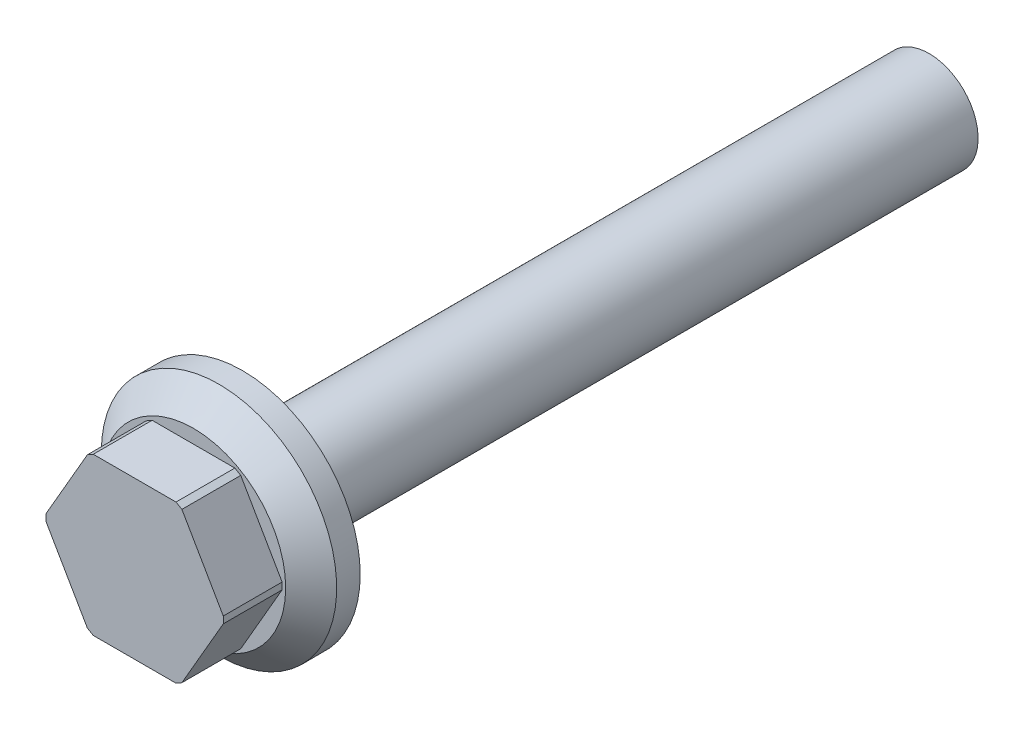
ISO-10303-21;
HEADER;
FILE_DESCRIPTION(('STEP AP214'),'2;1');
FILE_NAME('part.step','',(''),(''),'','','');
FILE_SCHEMA(('AUTOMOTIVE_DESIGN { 1 0 10303 214 1 1 1 1 }'));
ENDSEC;
DATA;
#1=APPLICATION_CONTEXT('core data for automotive mechanical design processes');
#2=APPLICATION_PROTOCOL_DEFINITION('international standard','automotive_design',2000,#1);
#3=PRODUCT_CONTEXT('',#1,'mechanical');
#4=PRODUCT('Part','Part','',(#3));
#5=PRODUCT_RELATED_PRODUCT_CATEGORY('part','',(#4));
#6=PRODUCT_DEFINITION_FORMATION('','',#4);
#7=PRODUCT_DEFINITION_CONTEXT('part definition',#1,'design');
#8=PRODUCT_DEFINITION('design','',#6,#7);
#9=PRODUCT_DEFINITION_SHAPE('','',#8);
#10=(LENGTH_UNIT() NAMED_UNIT(*) SI_UNIT(.MILLI.,.METRE.));
#11=(NAMED_UNIT(*) PLANE_ANGLE_UNIT() SI_UNIT($,.RADIAN.));
#12=(NAMED_UNIT(*) SI_UNIT($,.STERADIAN.) SOLID_ANGLE_UNIT());
#13=UNCERTAINTY_MEASURE_WITH_UNIT(LENGTH_MEASURE(1.E-05),#10,'distance_accuracy_value','');
#14=(GEOMETRIC_REPRESENTATION_CONTEXT(3) GLOBAL_UNCERTAINTY_ASSIGNED_CONTEXT((#13)) GLOBAL_UNIT_ASSIGNED_CONTEXT((#10,
#11,#12)) REPRESENTATION_CONTEXT('',''));
#15=CARTESIAN_POINT('',(0.,0.,0.));
#16=DIRECTION('',(0.,0.,1.));
#17=DIRECTION('',(1.,0.,0.));
#18=AXIS2_PLACEMENT_3D('',#15,#16,#17);
#19=CARTESIAN_POINT('',(0.,0.,-35.));
#20=DIRECTION('',(0.,0.,-1.));
#21=DIRECTION('',(-1.,0.,0.));
#22=AXIS2_PLACEMENT_3D('',#19,#20,#21);
#23=CYLINDRICAL_SURFACE('',#22,2.5);
#24=CARTESIAN_POINT('',(0.,0.,-35.));
#25=DIRECTION('',(0.,0.,-1.));
#26=DIRECTION('',(-1.,0.,0.));
#27=AXIS2_PLACEMENT_3D('',#24,#25,#26);
#28=CIRCLE('',#27,2.5);
#29=CARTESIAN_POINT('',(-2.5,0.,-35.));
#30=VERTEX_POINT('',#29);
#31=EDGE_CURVE('E229',#30,#30,#28,.T.);
#32=ORIENTED_EDGE('',*,*,#31,.F.);
#33=EDGE_LOOP('',(#32));
#34=FACE_BOUND('',#33,.T.);
#35=CARTESIAN_POINT('',(0.,0.,0.));
#36=DIRECTION('',(0.,0.,-1.));
#37=DIRECTION('',(-1.,0.,0.));
#38=AXIS2_PLACEMENT_3D('',#35,#36,#37);
#39=CIRCLE('',#38,2.5);
#40=CARTESIAN_POINT('',(-2.5,0.,0.));
#41=VERTEX_POINT('',#40);
#42=EDGE_CURVE('E228',#41,#41,#39,.T.);
#43=ORIENTED_EDGE('',*,*,#42,.T.);
#44=EDGE_LOOP('',(#43));
#45=FACE_BOUND('',#44,.T.);
#46=ADVANCED_FACE('F35',(#34,#45),#23,.T.);
#47=CARTESIAN_POINT('',(2.5,0.,-35.));
#48=DIRECTION('',(0.,0.,1.));
#49=DIRECTION('',(1.,0.,0.));
#50=AXIS2_PLACEMENT_3D('',#47,#48,#49);
#51=PLANE('',#50);
#52=ORIENTED_EDGE('',*,*,#31,.T.);
#53=EDGE_LOOP('',(#52));
#54=FACE_BOUND('',#53,.T.);
#55=ADVANCED_FACE('F276',(#54),#51,.F.);
#56=CARTESIAN_POINT('',(0.,0.,1.));
#57=DIRECTION('',(0.,0.,-1.));
#58=DIRECTION('',(-1.,0.,0.));
#59=AXIS2_PLACEMENT_3D('',#56,#57,#58);
#60=CYLINDRICAL_SURFACE('',#59,6.);
#61=CARTESIAN_POINT('',(0.,0.,1.20000000000002));
#62=DIRECTION('',(0.,0.,-1.));
#63=DIRECTION('',(-1.,0.,0.));
#64=AXIS2_PLACEMENT_3D('',#61,#62,#63);
#65=CIRCLE('',#64,6.);
#66=CARTESIAN_POINT('',(-6.,0.,1.20000000000002));
#67=VERTEX_POINT('',#66);
#68=EDGE_CURVE('E237',#67,#67,#65,.T.);
#69=ORIENTED_EDGE('',*,*,#68,.T.);
#70=EDGE_LOOP('',(#69));
#71=FACE_BOUND('',#70,.T.);
#72=CARTESIAN_POINT('',(0.,0.,0.));
#73=DIRECTION('',(0.,0.,1.));
#74=DIRECTION('',(1.,0.,0.));
#75=AXIS2_PLACEMENT_3D('',#72,#73,#74);
#76=CIRCLE('',#75,6.);
#77=CARTESIAN_POINT('',(6.,0.,0.));
#78=VERTEX_POINT('',#77);
#79=EDGE_CURVE('E225',#78,#78,#76,.T.);
#80=ORIENTED_EDGE('',*,*,#79,.T.);
#81=EDGE_LOOP('',(#80));
#82=FACE_BOUND('',#81,.T.);
#83=ADVANCED_FACE('F282',(#71,#82),#60,.T.);
#84=CARTESIAN_POINT('',(0.,0.,0.));
#85=DIRECTION('',(0.,0.,1.));
#86=DIRECTION('',(1.,0.,0.));
#87=AXIS2_PLACEMENT_3D('',#84,#85,#86);
#88=PLANE('',#87);
#89=ORIENTED_EDGE('',*,*,#42,.F.);
#90=EDGE_LOOP('',(#89));
#91=FACE_BOUND('',#90,.T.);
#92=ORIENTED_EDGE('',*,*,#79,.F.);
#93=EDGE_LOOP('',(#92));
#94=FACE_BOUND('',#93,.T.);
#95=ADVANCED_FACE('F336',(#91,#94),#88,.F.);
#96=CARTESIAN_POINT('',(0.,0.,2.5));
#97=DIRECTION('',(0.,0.,1.));
#98=DIRECTION('',(1.,0.,0.));
#99=AXIS2_PLACEMENT_3D('',#96,#97,#98);
#100=PLANE('',#99);
#101=DIRECTION('',(-1.,0.,0.));
#102=VECTOR('',#101,1.);
#103=CARTESIAN_POINT('',(0.,4.,2.5));
#104=LINE('',#103,#102);
#105=CARTESIAN_POINT('',(2.1094010767585,4.,2.5));
#106=VERTEX_POINT('',#105);
#107=CARTESIAN_POINT('',(-2.10940107675849,4.,2.5));
#108=VERTEX_POINT('',#107);
#109=EDGE_CURVE('E135',#106,#108,#104,.T.);
#110=ORIENTED_EDGE('',*,*,#109,.F.);
#111=DIRECTION('',(-0.866025403784437,0.500000000000002,0.));
#112=VECTOR('',#111,1.);
#113=CARTESIAN_POINT('',(2.40940107675851,3.8267949192431,2.5));
#114=LINE('',#113,#112);
#115=CARTESIAN_POINT('',(2.40940107675851,3.8267949192431,2.5));
#116=VERTEX_POINT('',#115);
#117=EDGE_CURVE('E161',#106,#116,#114,.F.);
#118=ORIENTED_EDGE('',*,*,#117,.T.);
#119=DIRECTION('',(-0.5,0.866025403784439,0.));
#120=VECTOR('',#119,1.);
#121=CARTESIAN_POINT('',(3.46410161513776,2.,2.5));
#122=LINE('',#121,#120);
#123=CARTESIAN_POINT('',(4.51880215351701,0.173205080756891,2.5));
#124=VERTEX_POINT('',#123);
#125=EDGE_CURVE('E171',#124,#116,#122,.T.);
#126=ORIENTED_EDGE('',*,*,#125,.F.);
#127=DIRECTION('',(0.,1.,0.));
#128=VECTOR('',#127,1.);
#129=CARTESIAN_POINT('',(4.51880215351701,-0.173205080756894,2.5));
#130=LINE('',#129,#128);
#131=CARTESIAN_POINT('',(4.51880215351701,-0.173205080756895,2.5));
#132=VERTEX_POINT('',#131);
#133=EDGE_CURVE('E44',#124,#132,#130,.F.);
#134=ORIENTED_EDGE('',*,*,#133,.T.);
#135=DIRECTION('',(0.5,0.866025403784439,0.));
#136=VECTOR('',#135,1.);
#137=CARTESIAN_POINT('',(3.46410161513776,-2.,2.5));
#138=LINE('',#137,#136);
#139=CARTESIAN_POINT('',(2.40940107675851,-3.8267949192431,2.5));
#140=VERTEX_POINT('',#139);
#141=EDGE_CURVE('E168',#140,#132,#138,.T.);
#142=ORIENTED_EDGE('',*,*,#141,.F.);
#143=DIRECTION('',(0.86602540378444,0.499999999999998,0.));
#144=VECTOR('',#143,1.);
#145=CARTESIAN_POINT('',(2.10940107675849,-4.,2.5));
#146=LINE('',#145,#144);
#147=CARTESIAN_POINT('',(2.10940107675849,-4.,2.5));
#148=VERTEX_POINT('',#147);
#149=EDGE_CURVE('E159',#140,#148,#146,.F.);
#150=ORIENTED_EDGE('',*,*,#149,.T.);
#151=DIRECTION('',(1.,0.,0.));
#152=VECTOR('',#151,1.);
#153=CARTESIAN_POINT('',(0.,-4.,2.5));
#154=LINE('',#153,#152);
#155=CARTESIAN_POINT('',(-2.10940107675851,-4.,2.5));
#156=VERTEX_POINT('',#155);
#157=EDGE_CURVE('E143',#156,#148,#154,.T.);
#158=ORIENTED_EDGE('',*,*,#157,.F.);
#159=DIRECTION('',(0.866025403784436,-0.500000000000004,0.));
#160=VECTOR('',#159,1.);
#161=CARTESIAN_POINT('',(-2.4094010767585,-3.82679491924312,2.5));
#162=LINE('',#161,#160);
#163=CARTESIAN_POINT('',(-2.4094010767585,-3.82679491924312,2.5));
#164=VERTEX_POINT('',#163);
#165=EDGE_CURVE('E142',#156,#164,#162,.F.);
#166=ORIENTED_EDGE('',*,*,#165,.T.);
#167=DIRECTION('',(0.5,-0.866025403784439,0.));
#168=VECTOR('',#167,1.);
#169=CARTESIAN_POINT('',(-3.46410161513776,-2.,2.5));
#170=LINE('',#169,#168);
#171=CARTESIAN_POINT('',(-4.51880215351701,-0.173205080756888,2.5));
#172=VERTEX_POINT('',#171);
#173=EDGE_CURVE('E129',#172,#164,#170,.T.);
#174=ORIENTED_EDGE('',*,*,#173,.F.);
#175=DIRECTION('',(0.,-1.,0.));
#176=VECTOR('',#175,1.);
#177=CARTESIAN_POINT('',(-4.51880215351701,0.173205080756892,2.5));
#178=LINE('',#177,#176);
#179=CARTESIAN_POINT('',(-4.51880215351701,0.173205080756892,2.5));
#180=VERTEX_POINT('',#179);
#181=EDGE_CURVE('E11',#172,#180,#178,.F.);
#182=ORIENTED_EDGE('',*,*,#181,.T.);
#183=DIRECTION('',(-0.5,-0.866025403784439,0.));
#184=VECTOR('',#183,1.);
#185=CARTESIAN_POINT('',(-3.46410161513776,2.,2.5));
#186=LINE('',#185,#184);
#187=CARTESIAN_POINT('',(-2.40940107675851,3.82679491924311,2.5));
#188=VERTEX_POINT('',#187);
#189=EDGE_CURVE('E144',#188,#180,#186,.T.);
#190=ORIENTED_EDGE('',*,*,#189,.F.);
#191=DIRECTION('',(-0.866025403784438,-0.500000000000001,0.));
#192=VECTOR('',#191,1.);
#193=CARTESIAN_POINT('',(-2.10940107675849,4.,2.5));
#194=LINE('',#193,#192);
#195=EDGE_CURVE('E163',#188,#108,#194,.F.);
#196=ORIENTED_EDGE('',*,*,#195,.T.);
#197=EDGE_LOOP('',(#110,#118,#126,#134,#142,#150,#158,#166,#174,#182,#190,#196));
#198=FACE_BOUND('',#197,.T.);
#199=CARTESIAN_POINT('',(0.,0.,2.5));
#200=DIRECTION('',(0.,0.,1.));
#201=DIRECTION('',(1.,0.,0.));
#202=AXIS2_PLACEMENT_3D('',#199,#200,#201);
#203=CIRCLE('',#202,4.70000000000003);
#204=CARTESIAN_POINT('',(-4.70000000000003,0.,2.5));
#205=VERTEX_POINT('',#204);
#206=EDGE_CURVE('E232',#205,#205,#203,.T.);
#207=ORIENTED_EDGE('',*,*,#206,.T.);
#208=EDGE_LOOP('',(#207));
#209=FACE_BOUND('',#208,.T.);
#210=ADVANCED_FACE('F138',(#198,#209),#100,.T.);
#211=CARTESIAN_POINT('',(0.,0.,2.80000000000003));
#212=DIRECTION('',(0.,0.,-1.));
#213=DIRECTION('',(-1.,0.,0.));
#214=AXIS2_PLACEMENT_3D('',#211,#212,#213);
#215=CONICAL_SURFACE('',#214,4.4,0.785398163397443);
#216=CARTESIAN_POINT('',(-6.,0.,1.20000000000002));
#217=CARTESIAN_POINT('',(-5.98645833333333,0.,1.21354166666668));
#218=CARTESIAN_POINT('',(-5.97291666666667,0.,1.22708333333335));
#219=CARTESIAN_POINT('',(-5.94583333333333,0.,1.25416666666668));
#220=CARTESIAN_POINT('',(-5.93229166666667,0.,1.26770833333335));
#221=CARTESIAN_POINT('',(-5.90520833333333,0.,1.29479166666668));
#222=CARTESIAN_POINT('',(-5.89166666666667,0.,1.30833333333335));
#223=CARTESIAN_POINT('',(-5.86458333333334,0.,1.33541666666668));
#224=CARTESIAN_POINT('',(-5.85104166666667,0.,1.34895833333335));
#225=CARTESIAN_POINT('',(-5.82395833333334,0.,1.37604166666668));
#226=CARTESIAN_POINT('',(-5.81041666666667,0.,1.38958333333335));
#227=CARTESIAN_POINT('',(-5.78333333333334,0.,1.41666666666668));
#228=CARTESIAN_POINT('',(-5.76979166666667,0.,1.43020833333335));
#229=CARTESIAN_POINT('',(-5.74270833333334,0.,1.45729166666668));
#230=CARTESIAN_POINT('',(-5.72916666666667,0.,1.47083333333335));
#231=CARTESIAN_POINT('',(-5.70208333333334,0.,1.49791666666668));
#232=CARTESIAN_POINT('',(-5.68854166666667,0.,1.51145833333335));
#233=CARTESIAN_POINT('',(-5.66145833333334,0.,1.53854166666668));
#234=CARTESIAN_POINT('',(-5.64791666666667,0.,1.55208333333335));
#235=CARTESIAN_POINT('',(-5.62083333333334,0.,1.57916666666668));
#236=CARTESIAN_POINT('',(-5.60729166666667,0.,1.59270833333334));
#237=CARTESIAN_POINT('',(-5.58020833333334,0.,1.61979166666668));
#238=CARTESIAN_POINT('',(-5.56666666666668,0.,1.63333333333334));
#239=CARTESIAN_POINT('',(-5.53958333333334,0.,1.66041666666668));
#240=CARTESIAN_POINT('',(-5.52604166666668,0.,1.67395833333334));
#241=CARTESIAN_POINT('',(-5.49895833333334,0.,1.70104166666668));
#242=CARTESIAN_POINT('',(-5.48541666666668,0.,1.71458333333334));
#243=CARTESIAN_POINT('',(-5.45833333333335,0.,1.74166666666668));
#244=CARTESIAN_POINT('',(-5.44479166666668,0.,1.75520833333334));
#245=CARTESIAN_POINT('',(-5.41770833333335,0.,1.78229166666668));
#246=CARTESIAN_POINT('',(-5.40416666666668,0.,1.79583333333334));
#247=CARTESIAN_POINT('',(-5.37708333333335,0.,1.82291666666668));
#248=CARTESIAN_POINT('',(-5.36354166666668,0.,1.83645833333334));
#249=CARTESIAN_POINT('',(-5.33645833333335,0.,1.86354166666667));
#250=CARTESIAN_POINT('',(-5.32291666666668,0.,1.87708333333334));
#251=CARTESIAN_POINT('',(-5.29583333333335,0.,1.90416666666667));
#252=CARTESIAN_POINT('',(-5.28229166666668,0.,1.91770833333334));
#253=CARTESIAN_POINT('',(-5.25520833333335,0.,1.94479166666667));
#254=CARTESIAN_POINT('',(-5.24166666666668,0.,1.95833333333334));
#255=CARTESIAN_POINT('',(-5.21458333333335,0.,1.98541666666667));
#256=CARTESIAN_POINT('',(-5.20104166666668,0.,1.99895833333334));
#257=CARTESIAN_POINT('',(-5.17395833333335,0.,2.02604166666667));
#258=CARTESIAN_POINT('',(-5.16041666666669,0.,2.03958333333334));
#259=CARTESIAN_POINT('',(-5.13333333333335,0.,2.06666666666667));
#260=CARTESIAN_POINT('',(-5.11979166666669,0.,2.08020833333334));
#261=CARTESIAN_POINT('',(-5.09270833333335,0.,2.10729166666667));
#262=CARTESIAN_POINT('',(-5.07916666666669,0.,2.12083333333334));
#263=CARTESIAN_POINT('',(-5.05208333333335,0.,2.14791666666667));
#264=CARTESIAN_POINT('',(-5.03854166666669,0.,2.16145833333334));
#265=CARTESIAN_POINT('',(-5.01145833333336,0.,2.18854166666667));
#266=CARTESIAN_POINT('',(-4.99791666666669,0.,2.20208333333334));
#267=CARTESIAN_POINT('',(-4.97083333333336,0.,2.22916666666667));
#268=CARTESIAN_POINT('',(-4.95729166666669,0.,2.24270833333334));
#269=CARTESIAN_POINT('',(-4.93020833333336,0.,2.26979166666667));
#270=CARTESIAN_POINT('',(-4.91666666666669,0.,2.28333333333334));
#271=CARTESIAN_POINT('',(-4.88958333333336,0.,2.31041666666667));
#272=CARTESIAN_POINT('',(-4.87604166666669,0.,2.32395833333334));
#273=CARTESIAN_POINT('',(-4.84895833333336,0.,2.35104166666667));
#274=CARTESIAN_POINT('',(-4.83541666666669,0.,2.36458333333333));
#275=CARTESIAN_POINT('',(-4.80833333333336,0.,2.39166666666667));
#276=CARTESIAN_POINT('',(-4.79479166666669,0.,2.40520833333333));
#277=CARTESIAN_POINT('',(-4.76770833333336,0.,2.43229166666667));
#278=CARTESIAN_POINT('',(-4.75416666666669,0.,2.44583333333333));
#279=CARTESIAN_POINT('',(-4.72708333333336,0.,2.47291666666667));
#280=CARTESIAN_POINT('',(-4.71354166666669,0.,2.48645833333333));
#281=CARTESIAN_POINT('',(-4.70000000000003,0.,2.5));
#282=B_SPLINE_CURVE_WITH_KNOTS('',3,(#216,#217,#218,#219,#220,#221,#222,#223,#224,#225,#226,
#227,#228,#229,#230,#231,#232,#233,#234,#235,#236,#237,#238,#239,#240,#241,#242,#243,#244,#245,
#246,#247,#248,#249,#250,#251,#252,#253,#254,#255,#256,#257,#258,#259,#260,#261,#262,#263,#264,
#265,#266,#267,#268,#269,#270,#271,#272,#273,#274,#275,#276,#277,#278,#279,#280,#281),
.UNSPECIFIED.,.F.,.F.,(4,2,2,2,2,2,2,2,2,2,2,2,2,2,2,2,2,2,2,2,2,2,2,2,2,2,2,2,2,2,2,2,4),(0.,
0.0574524259714059,0.114904851942812,0.172357277914218,0.229809703885624,0.28726212985703,
0.344714555828436,0.402166981799841,0.459619407771247,0.517071833742653,0.574524259714059,
0.631976685685465,0.689429111656871,0.746881537628277,0.804333963599683,0.861786389571089,
0.919238815542495,0.976691241513901,1.03414366748531,1.09159609345671,1.14904851942812,
1.20650094539952,1.26395337137093,1.32140579734234,1.37885822331374,1.43631064928515,
1.49376307525655,1.55121550122796,1.60866792719937,1.66612035317077,1.72357277914218,
1.78102520511358,1.83847763108499),.UNSPECIFIED.);
#283=EDGE_CURVE('BSEAM290',#67,#205,#282,.T.);
#284=ORIENTED_EDGE('',*,*,#68,.F.);
#285=ORIENTED_EDGE('',*,*,#206,.F.);
#286=ORIENTED_EDGE('',*,*,#283,.T.);
#287=ORIENTED_EDGE('',*,*,#283,.F.);
#288=EDGE_LOOP('',(#284,#286,#285,#287));
#289=FACE_BOUND('',#288,.T.);
#290=ADVANCED_FACE('F290',(#289),#215,.T.);
#291=CARTESIAN_POINT('',(2.30940107675851,4.,1.));
#292=DIRECTION('',(0.,1.,0.));
#293=DIRECTION('',(0.,0.,1.));
#294=AXIS2_PLACEMENT_3D('',#291,#292,#293);
#295=PLANE('',#294);
#296=DIRECTION('',(-1.,0.,0.));
#297=VECTOR('',#296,1.);
#298=CARTESIAN_POINT('',(2.30940107675851,4.,5.5));
#299=LINE('',#298,#297);
#300=CARTESIAN_POINT('',(2.1094010767585,4.,5.5));
#301=VERTEX_POINT('',#300);
#302=CARTESIAN_POINT('',(-2.10940107675849,4.,5.5));
#303=VERTEX_POINT('',#302);
#304=EDGE_CURVE('E204',#301,#303,#299,.T.);
#305=ORIENTED_EDGE('',*,*,#304,.F.);
#306=DIRECTION('',(0.,0.,-1.));
#307=VECTOR('',#306,1.);
#308=CARTESIAN_POINT('',(2.1094010767585,4.,1.));
#309=LINE('',#308,#307);
#310=EDGE_CURVE('E151',#301,#106,#309,.T.);
#311=ORIENTED_EDGE('',*,*,#310,.T.);
#312=ORIENTED_EDGE('',*,*,#109,.T.);
#313=DIRECTION('',(0.,0.,1.));
#314=VECTOR('',#313,1.);
#315=CARTESIAN_POINT('',(-2.10940107675849,4.,1.));
#316=LINE('',#315,#314);
#317=EDGE_CURVE('E154',#108,#303,#316,.T.);
#318=ORIENTED_EDGE('',*,*,#317,.T.);
#319=EDGE_LOOP('',(#305,#311,#312,#318));
#320=FACE_BOUND('',#319,.T.);
#321=ADVANCED_FACE('F203',(#320),#295,.T.);
#322=CARTESIAN_POINT('',(4.61880215351701,0.,1.));
#323=DIRECTION('',(0.866025403784439,0.5,0.));
#324=DIRECTION('',(-0.5,0.866025403784439,0.));
#325=AXIS2_PLACEMENT_3D('',#322,#323,#324);
#326=PLANE('',#325);
#327=ORIENTED_EDGE('',*,*,#125,.T.);
#328=DIRECTION('',(0.,0.,1.));
#329=VECTOR('',#328,1.);
#330=CARTESIAN_POINT('',(2.40940107675851,3.8267949192431,1.));
#331=LINE('',#330,#329);
#332=CARTESIAN_POINT('',(2.40940107675851,3.8267949192431,5.5));
#333=VERTEX_POINT('',#332);
#334=EDGE_CURVE('E195',#116,#333,#331,.T.);
#335=ORIENTED_EDGE('',*,*,#334,.T.);
#336=DIRECTION('',(-0.5,0.866025403784439,0.));
#337=VECTOR('',#336,1.);
#338=CARTESIAN_POINT('',(4.61880215351701,0.,5.5));
#339=LINE('',#338,#337);
#340=CARTESIAN_POINT('',(4.51880215351701,0.173205080756892,5.5));
#341=VERTEX_POINT('',#340);
#342=EDGE_CURVE('E223',#341,#333,#339,.T.);
#343=ORIENTED_EDGE('',*,*,#342,.F.);
#344=DIRECTION('',(0.,0.,-1.));
#345=VECTOR('',#344,1.);
#346=CARTESIAN_POINT('',(4.51880215351701,0.173205080756892,1.));
#347=LINE('',#346,#345);
#348=EDGE_CURVE('E188',#341,#124,#347,.T.);
#349=ORIENTED_EDGE('',*,*,#348,.T.);
#350=EDGE_LOOP('',(#327,#335,#343,#349));
#351=FACE_BOUND('',#350,.T.);
#352=ADVANCED_FACE('F333',(#351),#326,.T.);
#353=CARTESIAN_POINT('',(2.3094010767585,-4.,1.));
#354=DIRECTION('',(0.866025403784439,-0.5,0.));
#355=DIRECTION('',(0.5,0.866025403784439,0.));
#356=AXIS2_PLACEMENT_3D('',#353,#354,#355);
#357=PLANE('',#356);
#358=DIRECTION('',(0.5,0.866025403784438,0.));
#359=VECTOR('',#358,1.);
#360=CARTESIAN_POINT('',(2.3094010767585,-4.,5.5));
#361=LINE('',#360,#359);
#362=CARTESIAN_POINT('',(2.40940107675851,-3.8267949192431,5.5));
#363=VERTEX_POINT('',#362);
#364=CARTESIAN_POINT('',(4.51880215351701,-0.173205080756895,5.5));
#365=VERTEX_POINT('',#364);
#366=EDGE_CURVE('E221',#363,#365,#361,.T.);
#367=ORIENTED_EDGE('',*,*,#366,.F.);
#368=DIRECTION('',(0.,0.,-1.));
#369=VECTOR('',#368,1.);
#370=CARTESIAN_POINT('',(2.40940107675851,-3.8267949192431,1.));
#371=LINE('',#370,#369);
#372=EDGE_CURVE('E182',#363,#140,#371,.T.);
#373=ORIENTED_EDGE('',*,*,#372,.T.);
#374=ORIENTED_EDGE('',*,*,#141,.T.);
#375=DIRECTION('',(0.,0.,1.));
#376=VECTOR('',#375,1.);
#377=CARTESIAN_POINT('',(4.51880215351701,-0.173205080756895,1.));
#378=LINE('',#377,#376);
#379=EDGE_CURVE('E179',#132,#365,#378,.T.);
#380=ORIENTED_EDGE('',*,*,#379,.T.);
#381=EDGE_LOOP('',(#367,#373,#374,#380));
#382=FACE_BOUND('',#381,.T.);
#383=ADVANCED_FACE('F178',(#382),#357,.T.);
#384=CARTESIAN_POINT('',(-2.3094010767585,-4.,1.));
#385=DIRECTION('',(0.,-1.,0.));
#386=DIRECTION('',(0.,0.,-1.));
#387=AXIS2_PLACEMENT_3D('',#384,#385,#386);
#388=PLANE('',#387);
#389=DIRECTION('',(1.,0.,0.));
#390=VECTOR('',#389,1.);
#391=CARTESIAN_POINT('',(-2.3094010767585,-4.,5.5));
#392=LINE('',#391,#390);
#393=CARTESIAN_POINT('',(-2.10940107675851,-4.,5.5));
#394=VERTEX_POINT('',#393);
#395=CARTESIAN_POINT('',(2.10940107675849,-4.,5.5));
#396=VERTEX_POINT('',#395);
#397=EDGE_CURVE('E218',#394,#396,#392,.T.);
#398=ORIENTED_EDGE('',*,*,#397,.F.);
#399=DIRECTION('',(0.,0.,-1.));
#400=VECTOR('',#399,1.);
#401=CARTESIAN_POINT('',(-2.10940107675851,-4.,1.));
#402=LINE('',#401,#400);
#403=EDGE_CURVE('E186',#394,#156,#402,.T.);
#404=ORIENTED_EDGE('',*,*,#403,.T.);
#405=ORIENTED_EDGE('',*,*,#157,.T.);
#406=DIRECTION('',(0.,0.,1.));
#407=VECTOR('',#406,1.);
#408=CARTESIAN_POINT('',(2.10940107675849,-4.,1.));
#409=LINE('',#408,#407);
#410=EDGE_CURVE('E190',#148,#396,#409,.T.);
#411=ORIENTED_EDGE('',*,*,#410,.T.);
#412=EDGE_LOOP('',(#398,#404,#405,#411));
#413=FACE_BOUND('',#412,.T.);
#414=ADVANCED_FACE('F257',(#413),#388,.T.);
#415=CARTESIAN_POINT('',(-4.61880215351701,0.,1.));
#416=DIRECTION('',(-0.866025403784439,-0.5,0.));
#417=DIRECTION('',(0.5,-0.866025403784439,0.));
#418=AXIS2_PLACEMENT_3D('',#415,#416,#417);
#419=PLANE('',#418);
#420=ORIENTED_EDGE('',*,*,#173,.T.);
#421=DIRECTION('',(0.,0.,1.));
#422=VECTOR('',#421,1.);
#423=CARTESIAN_POINT('',(-2.4094010767585,-3.82679491924312,1.));
#424=LINE('',#423,#422);
#425=CARTESIAN_POINT('',(-2.4094010767585,-3.82679491924311,5.5));
#426=VERTEX_POINT('',#425);
#427=EDGE_CURVE('E134',#164,#426,#424,.T.);
#428=ORIENTED_EDGE('',*,*,#427,.T.);
#429=DIRECTION('',(0.5,-0.866025403784439,0.));
#430=VECTOR('',#429,1.);
#431=CARTESIAN_POINT('',(-4.61880215351701,0.,5.5));
#432=LINE('',#431,#430);
#433=CARTESIAN_POINT('',(-4.51880215351701,-0.173205080756888,5.5));
#434=VERTEX_POINT('',#433);
#435=EDGE_CURVE('E132',#434,#426,#432,.T.);
#436=ORIENTED_EDGE('',*,*,#435,.F.);
#437=DIRECTION('',(0.,0.,-1.));
#438=VECTOR('',#437,1.);
#439=CARTESIAN_POINT('',(-4.51880215351701,-0.173205080756888,1.));
#440=LINE('',#439,#438);
#441=EDGE_CURVE('E126',#434,#172,#440,.T.);
#442=ORIENTED_EDGE('',*,*,#441,.T.);
#443=EDGE_LOOP('',(#420,#428,#436,#442));
#444=FACE_BOUND('',#443,.T.);
#445=ADVANCED_FACE('F127',(#444),#419,.T.);
#446=CARTESIAN_POINT('',(-2.3094010767585,4.,1.));
#447=DIRECTION('',(-0.866025403784438,0.5,0.));
#448=DIRECTION('',(-0.5,-0.866025403784439,0.));
#449=AXIS2_PLACEMENT_3D('',#446,#447,#448);
#450=PLANE('',#449);
#451=DIRECTION('',(-0.5,-0.866025403784439,0.));
#452=VECTOR('',#451,1.);
#453=CARTESIAN_POINT('',(-2.3094010767585,4.,5.5));
#454=LINE('',#453,#452);
#455=CARTESIAN_POINT('',(-2.40940107675851,3.8267949192431,5.5));
#456=VERTEX_POINT('',#455);
#457=CARTESIAN_POINT('',(-4.51880215351701,0.173205080756892,5.5));
#458=VERTEX_POINT('',#457);
#459=EDGE_CURVE('E213',#456,#458,#454,.T.);
#460=ORIENTED_EDGE('',*,*,#459,.F.);
#461=DIRECTION('',(0.,0.,-1.));
#462=VECTOR('',#461,1.);
#463=CARTESIAN_POINT('',(-2.40940107675851,3.8267949192431,1.));
#464=LINE('',#463,#462);
#465=EDGE_CURVE('E56',#456,#188,#464,.T.);
#466=ORIENTED_EDGE('',*,*,#465,.T.);
#467=ORIENTED_EDGE('',*,*,#189,.T.);
#468=DIRECTION('',(0.,0.,1.));
#469=VECTOR('',#468,1.);
#470=CARTESIAN_POINT('',(-4.51880215351701,0.173205080756892,1.));
#471=LINE('',#470,#469);
#472=EDGE_CURVE('E148',#180,#458,#471,.T.);
#473=ORIENTED_EDGE('',*,*,#472,.T.);
#474=EDGE_LOOP('',(#460,#466,#467,#473));
#475=FACE_BOUND('',#474,.T.);
#476=ADVANCED_FACE('F320',(#475),#450,.T.);
#477=CARTESIAN_POINT('',(0.,0.,5.5));
#478=DIRECTION('',(0.,0.,1.));
#479=DIRECTION('',(1.,0.,0.));
#480=AXIS2_PLACEMENT_3D('',#477,#478,#479);
#481=PLANE('',#480);
#482=ORIENTED_EDGE('',*,*,#435,.T.);
#483=DIRECTION('',(-0.866025403784436,0.500000000000004,0.));
#484=VECTOR('',#483,1.);
#485=CARTESIAN_POINT('',(-2.25940107675852,-3.91339745962155,5.5));
#486=LINE('',#485,#484);
#487=EDGE_CURVE('E252',#426,#394,#486,.F.);
#488=ORIENTED_EDGE('',*,*,#487,.T.);
#489=ORIENTED_EDGE('',*,*,#397,.T.);
#490=DIRECTION('',(-0.86602540378444,-0.499999999999998,0.));
#491=VECTOR('',#490,1.);
#492=CARTESIAN_POINT('',(2.25940107675849,-3.91339745962156,5.5));
#493=LINE('',#492,#491);
#494=EDGE_CURVE('E250',#396,#363,#493,.F.);
#495=ORIENTED_EDGE('',*,*,#494,.T.);
#496=ORIENTED_EDGE('',*,*,#366,.T.);
#497=DIRECTION('',(0.,-1.,0.));
#498=VECTOR('',#497,1.);
#499=CARTESIAN_POINT('',(4.51880215351701,0.,5.5));
#500=LINE('',#499,#498);
#501=EDGE_CURVE('E185',#365,#341,#500,.F.);
#502=ORIENTED_EDGE('',*,*,#501,.T.);
#503=ORIENTED_EDGE('',*,*,#342,.T.);
#504=DIRECTION('',(0.866025403784437,-0.500000000000002,0.));
#505=VECTOR('',#504,1.);
#506=CARTESIAN_POINT('',(2.25940107675851,3.91339745962155,5.5));
#507=LINE('',#506,#505);
#508=EDGE_CURVE('E212',#333,#301,#507,.F.);
#509=ORIENTED_EDGE('',*,*,#508,.T.);
#510=ORIENTED_EDGE('',*,*,#304,.T.);
#511=DIRECTION('',(0.866025403784438,0.500000000000001,0.));
#512=VECTOR('',#511,1.);
#513=CARTESIAN_POINT('',(-2.25940107675851,3.91339745962155,5.5));
#514=LINE('',#513,#512);
#515=EDGE_CURVE('E210',#303,#456,#514,.F.);
#516=ORIENTED_EDGE('',*,*,#515,.T.);
#517=ORIENTED_EDGE('',*,*,#459,.T.);
#518=DIRECTION('',(0.,1.,0.));
#519=VECTOR('',#518,1.);
#520=CARTESIAN_POINT('',(-4.51880215351701,0.,5.5));
#521=LINE('',#520,#519);
#522=EDGE_CURVE('E149',#458,#434,#521,.F.);
#523=ORIENTED_EDGE('',*,*,#522,.T.);
#524=EDGE_LOOP('',(#482,#488,#489,#495,#496,#502,#503,#509,#510,#516,#517,#523));
#525=FACE_BOUND('',#524,.T.);
#526=ADVANCED_FACE('F209',(#525),#481,.T.);
#527=CARTESIAN_POINT('',(-2.4094010767585,-3.82679491924312,1.));
#528=DIRECTION('',(0.500000000000004,0.866025403784436,0.));
#529=DIRECTION('',(0.,0.,1.));
#530=AXIS2_PLACEMENT_3D('',#527,#528,#529);
#531=PLANE('',#530);
#532=ORIENTED_EDGE('',*,*,#165,.F.);
#533=ORIENTED_EDGE('',*,*,#403,.F.);
#534=ORIENTED_EDGE('',*,*,#487,.F.);
#535=ORIENTED_EDGE('',*,*,#427,.F.);
#536=EDGE_LOOP('',(#532,#533,#534,#535));
#537=FACE_BOUND('',#536,.T.);
#538=ADVANCED_FACE('F261',(#537),#531,.F.);
#539=CARTESIAN_POINT('',(2.10940107675849,-4.,1.));
#540=DIRECTION('',(-0.499999999999998,0.86602540378444,0.));
#541=DIRECTION('',(0.,0.,1.));
#542=AXIS2_PLACEMENT_3D('',#539,#540,#541);
#543=PLANE('',#542);
#544=ORIENTED_EDGE('',*,*,#149,.F.);
#545=ORIENTED_EDGE('',*,*,#372,.F.);
#546=ORIENTED_EDGE('',*,*,#494,.F.);
#547=ORIENTED_EDGE('',*,*,#410,.F.);
#548=EDGE_LOOP('',(#544,#545,#546,#547));
#549=FACE_BOUND('',#548,.T.);
#550=ADVANCED_FACE('F262',(#549),#543,.F.);
#551=CARTESIAN_POINT('',(2.40940107675851,3.8267949192431,1.));
#552=DIRECTION('',(-0.500000000000002,-0.866025403784437,0.));
#553=DIRECTION('',(0.,0.,1.));
#554=AXIS2_PLACEMENT_3D('',#551,#552,#553);
#555=PLANE('',#554);
#556=ORIENTED_EDGE('',*,*,#117,.F.);
#557=ORIENTED_EDGE('',*,*,#310,.F.);
#558=ORIENTED_EDGE('',*,*,#508,.F.);
#559=ORIENTED_EDGE('',*,*,#334,.F.);
#560=EDGE_LOOP('',(#556,#557,#558,#559));
#561=FACE_BOUND('',#560,.T.);
#562=ADVANCED_FACE('F264',(#561),#555,.F.);
#563=CARTESIAN_POINT('',(-2.10940107675849,4.,1.));
#564=DIRECTION('',(0.500000000000001,-0.866025403784438,0.));
#565=DIRECTION('',(0.,0.,1.));
#566=AXIS2_PLACEMENT_3D('',#563,#564,#565);
#567=PLANE('',#566);
#568=ORIENTED_EDGE('',*,*,#195,.F.);
#569=ORIENTED_EDGE('',*,*,#465,.F.);
#570=ORIENTED_EDGE('',*,*,#515,.F.);
#571=ORIENTED_EDGE('',*,*,#317,.F.);
#572=EDGE_LOOP('',(#568,#569,#570,#571));
#573=FACE_BOUND('',#572,.T.);
#574=ADVANCED_FACE('F270',(#573),#567,.F.);
#575=CARTESIAN_POINT('',(4.51880215351701,-0.173205080756894,1.));
#576=DIRECTION('',(-1.,0.,0.));
#577=DIRECTION('',(0.,0.,1.));
#578=AXIS2_PLACEMENT_3D('',#575,#576,#577);
#579=PLANE('',#578);
#580=ORIENTED_EDGE('',*,*,#133,.F.);
#581=ORIENTED_EDGE('',*,*,#348,.F.);
#582=ORIENTED_EDGE('',*,*,#501,.F.);
#583=ORIENTED_EDGE('',*,*,#379,.F.);
#584=EDGE_LOOP('',(#580,#581,#582,#583));
#585=FACE_BOUND('',#584,.T.);
#586=ADVANCED_FACE('F184',(#585),#579,.F.);
#587=CARTESIAN_POINT('',(-4.51880215351701,0.173205080756892,1.));
#588=DIRECTION('',(1.,0.,0.));
#589=DIRECTION('',(0.,0.,1.));
#590=AXIS2_PLACEMENT_3D('',#587,#588,#589);
#591=PLANE('',#590);
#592=ORIENTED_EDGE('',*,*,#181,.F.);
#593=ORIENTED_EDGE('',*,*,#441,.F.);
#594=ORIENTED_EDGE('',*,*,#522,.F.);
#595=ORIENTED_EDGE('',*,*,#472,.F.);
#596=EDGE_LOOP('',(#592,#593,#594,#595));
#597=FACE_BOUND('',#596,.T.);
#598=ADVANCED_FACE('F38',(#597),#591,.F.);
#599=CLOSED_SHELL('',(#46,#55,#83,#95,#210,#290,#321,#352,#383,#414,#445,#476,#526,#538,#550,
#562,#574,#586,#598));
#600=MANIFOLD_SOLID_BREP('B2',#599);
#601=ADVANCED_BREP_SHAPE_REPRESENTATION('',(#18,#600),#14);
#602=SHAPE_DEFINITION_REPRESENTATION(#9,#601);
ENDSEC;
END-ISO-10303-21;
